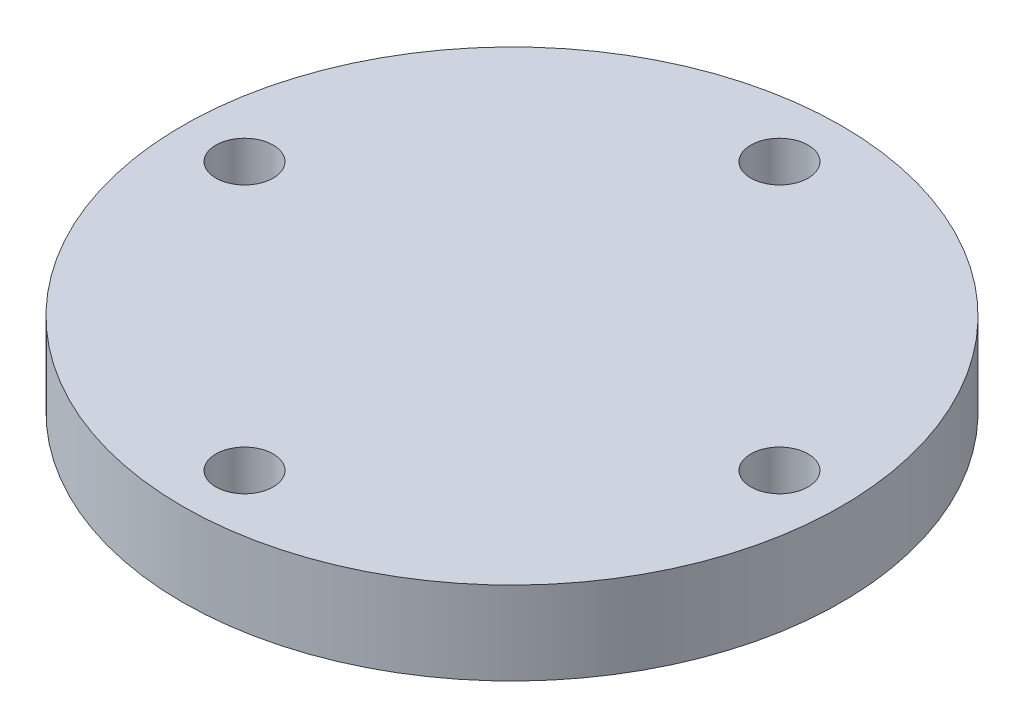
ISO-10303-21;
HEADER;
FILE_DESCRIPTION(('STEP AP214'),'2;1');
FILE_NAME('part.step','',(''),(''),'','','');
FILE_SCHEMA(('AUTOMOTIVE_DESIGN { 1 0 10303 214 1 1 1 1 }'));
ENDSEC;
DATA;
#1=APPLICATION_CONTEXT('core data for automotive mechanical design processes');
#2=APPLICATION_PROTOCOL_DEFINITION('international standard','automotive_design',2000,#1);
#3=PRODUCT_CONTEXT('',#1,'mechanical');
#4=PRODUCT('Part','Part','',(#3));
#5=PRODUCT_RELATED_PRODUCT_CATEGORY('part','',(#4));
#6=PRODUCT_DEFINITION_FORMATION('','',#4);
#7=PRODUCT_DEFINITION_CONTEXT('part definition',#1,'design');
#8=PRODUCT_DEFINITION('design','',#6,#7);
#9=PRODUCT_DEFINITION_SHAPE('','',#8);
#10=(LENGTH_UNIT() NAMED_UNIT(*) SI_UNIT(.MILLI.,.METRE.));
#11=(NAMED_UNIT(*) PLANE_ANGLE_UNIT() SI_UNIT($,.RADIAN.));
#12=(NAMED_UNIT(*) SI_UNIT($,.STERADIAN.) SOLID_ANGLE_UNIT());
#13=UNCERTAINTY_MEASURE_WITH_UNIT(LENGTH_MEASURE(1.E-05),#10,'distance_accuracy_value','');
#14=(GEOMETRIC_REPRESENTATION_CONTEXT(3) GLOBAL_UNCERTAINTY_ASSIGNED_CONTEXT((#13)) GLOBAL_UNIT_ASSIGNED_CONTEXT((#10,
#11,#12)) REPRESENTATION_CONTEXT('',''));
#15=CARTESIAN_POINT('',(0.,0.,0.));
#16=DIRECTION('',(0.,0.,1.));
#17=DIRECTION('',(1.,0.,0.));
#18=AXIS2_PLACEMENT_3D('',#15,#16,#17);
#19=CARTESIAN_POINT('',(0.,8.7,0.));
#20=DIRECTION('',(0.,-1.,0.));
#21=DIRECTION('',(0.,0.,-1.));
#22=AXIS2_PLACEMENT_3D('',#19,#20,#21);
#23=CYLINDRICAL_SURFACE('',#22,34.5);
#24=CARTESIAN_POINT('',(0.,8.7,0.));
#25=DIRECTION('',(0.,1.,0.));
#26=DIRECTION('',(0.,0.,1.));
#27=AXIS2_PLACEMENT_3D('',#24,#25,#26);
#28=CIRCLE('',#27,34.5);
#29=CARTESIAN_POINT('',(0.,8.7,34.5));
#30=VERTEX_POINT('',#29);
#31=EDGE_CURVE('E10',#30,#30,#28,.T.);
#32=ORIENTED_EDGE('',*,*,#31,.F.);
#33=EDGE_LOOP('',(#32));
#34=FACE_BOUND('',#33,.T.);
#35=CARTESIAN_POINT('',(0.,0.,0.));
#36=DIRECTION('',(0.,1.,0.));
#37=DIRECTION('',(0.,0.,1.));
#38=AXIS2_PLACEMENT_3D('',#35,#36,#37);
#39=CIRCLE('',#38,34.5);
#40=CARTESIAN_POINT('',(0.,0.,34.5));
#41=VERTEX_POINT('',#40);
#42=EDGE_CURVE('E32',#41,#41,#39,.T.);
#43=ORIENTED_EDGE('',*,*,#42,.T.);
#44=EDGE_LOOP('',(#43));
#45=FACE_BOUND('',#44,.T.);
#46=ADVANCED_FACE('F29',(#34,#45),#23,.T.);
#47=CARTESIAN_POINT('',(0.,8.7,0.));
#48=DIRECTION('',(0.,1.,0.));
#49=DIRECTION('',(0.,0.,1.));
#50=AXIS2_PLACEMENT_3D('',#47,#48,#49);
#51=PLANE('',#50);
#52=CARTESIAN_POINT('',(-27.9999999999996,8.7,3.93769828779805E-13));
#53=DIRECTION('',(0.,1.,0.));
#54=DIRECTION('',(0.,0.,1.));
#55=AXIS2_PLACEMENT_3D('',#52,#53,#54);
#56=CIRCLE('',#55,3.00000000000077);
#57=CARTESIAN_POINT('',(-27.9999999999996,8.7,3.00000000000117));
#58=VERTEX_POINT('',#57);
#59=EDGE_CURVE('E59',#58,#58,#56,.T.);
#60=ORIENTED_EDGE('',*,*,#59,.F.);
#61=EDGE_LOOP('',(#60));
#62=FACE_BOUND('',#61,.T.);
#63=CARTESIAN_POINT('',(7.94397679634836E-13,8.7,28.));
#64=DIRECTION('',(0.,1.,0.));
#65=DIRECTION('',(0.,0.,1.));
#66=AXIS2_PLACEMENT_3D('',#63,#64,#65);
#67=CIRCLE('',#66,3.00000000000077);
#68=CARTESIAN_POINT('',(7.94397679634836E-13,8.7,31.0000000000008));
#69=VERTEX_POINT('',#68);
#70=EDGE_CURVE('E53',#69,#69,#67,.T.);
#71=ORIENTED_EDGE('',*,*,#70,.F.);
#72=EDGE_LOOP('',(#71));
#73=FACE_BOUND('',#72,.T.);
#74=CARTESIAN_POINT('',(28.0000000000004,8.7,-3.97198839817418E-13));
#75=DIRECTION('',(0.,1.,0.));
#76=DIRECTION('',(0.,0.,1.));
#77=AXIS2_PLACEMENT_3D('',#74,#75,#76);
#78=CIRCLE('',#77,3.00000000000077);
#79=CARTESIAN_POINT('',(28.0000000000004,8.7,3.00000000000038));
#80=VERTEX_POINT('',#79);
#81=EDGE_CURVE('E47',#80,#80,#78,.T.);
#82=ORIENTED_EDGE('',*,*,#81,.F.);
#83=EDGE_LOOP('',(#82));
#84=FACE_BOUND('',#83,.T.);
#85=CARTESIAN_POINT('',(0.,8.7,-28.));
#86=DIRECTION('',(0.,1.,0.));
#87=DIRECTION('',(0.,0.,1.));
#88=AXIS2_PLACEMENT_3D('',#85,#86,#87);
#89=CIRCLE('',#88,3.00000000000077);
#90=CARTESIAN_POINT('',(0.,8.7,-24.9999999999992));
#91=VERTEX_POINT('',#90);
#92=EDGE_CURVE('E41',#91,#91,#89,.T.);
#93=ORIENTED_EDGE('',*,*,#92,.F.);
#94=EDGE_LOOP('',(#93));
#95=FACE_BOUND('',#94,.T.);
#96=ORIENTED_EDGE('',*,*,#31,.T.);
#97=EDGE_LOOP('',(#96));
#98=FACE_BOUND('',#97,.T.);
#99=ADVANCED_FACE('F75',(#62,#73,#84,#95,#98),#51,.T.);
#100=CARTESIAN_POINT('',(0.,0.,0.));
#101=DIRECTION('',(0.,1.,0.));
#102=DIRECTION('',(0.,0.,1.));
#103=AXIS2_PLACEMENT_3D('',#100,#101,#102);
#104=PLANE('',#103);
#105=CARTESIAN_POINT('',(-27.9999999999996,0.,3.93769828779805E-13));
#106=DIRECTION('',(0.,1.,0.));
#107=DIRECTION('',(0.,0.,1.));
#108=AXIS2_PLACEMENT_3D('',#105,#106,#107);
#109=CIRCLE('',#108,3.00000000000077);
#110=CARTESIAN_POINT('',(-27.9999999999996,0.,3.00000000000117));
#111=VERTEX_POINT('',#110);
#112=EDGE_CURVE('E56',#111,#111,#109,.T.);
#113=ORIENTED_EDGE('',*,*,#112,.T.);
#114=EDGE_LOOP('',(#113));
#115=FACE_BOUND('',#114,.T.);
#116=CARTESIAN_POINT('',(7.94397679634836E-13,0.,28.));
#117=DIRECTION('',(0.,1.,0.));
#118=DIRECTION('',(0.,0.,1.));
#119=AXIS2_PLACEMENT_3D('',#116,#117,#118);
#120=CIRCLE('',#119,3.00000000000077);
#121=CARTESIAN_POINT('',(7.94397679634836E-13,0.,31.0000000000008));
#122=VERTEX_POINT('',#121);
#123=EDGE_CURVE('E50',#122,#122,#120,.T.);
#124=ORIENTED_EDGE('',*,*,#123,.T.);
#125=EDGE_LOOP('',(#124));
#126=FACE_BOUND('',#125,.T.);
#127=CARTESIAN_POINT('',(28.0000000000004,0.,-3.97198839817418E-13));
#128=DIRECTION('',(0.,1.,0.));
#129=DIRECTION('',(0.,0.,1.));
#130=AXIS2_PLACEMENT_3D('',#127,#128,#129);
#131=CIRCLE('',#130,3.00000000000077);
#132=CARTESIAN_POINT('',(28.0000000000004,0.,3.00000000000038));
#133=VERTEX_POINT('',#132);
#134=EDGE_CURVE('E44',#133,#133,#131,.T.);
#135=ORIENTED_EDGE('',*,*,#134,.T.);
#136=EDGE_LOOP('',(#135));
#137=FACE_BOUND('',#136,.T.);
#138=CARTESIAN_POINT('',(0.,0.,-28.));
#139=DIRECTION('',(0.,1.,0.));
#140=DIRECTION('',(0.,0.,1.));
#141=AXIS2_PLACEMENT_3D('',#138,#139,#140);
#142=CIRCLE('',#141,3.00000000000077);
#143=CARTESIAN_POINT('',(0.,0.,-24.9999999999992));
#144=VERTEX_POINT('',#143);
#145=EDGE_CURVE('E39',#144,#144,#142,.T.);
#146=ORIENTED_EDGE('',*,*,#145,.T.);
#147=EDGE_LOOP('',(#146));
#148=FACE_BOUND('',#147,.T.);
#149=ORIENTED_EDGE('',*,*,#42,.F.);
#150=EDGE_LOOP('',(#149));
#151=FACE_BOUND('',#150,.T.);
#152=ADVANCED_FACE('F65',(#115,#126,#137,#148,#151),#104,.F.);
#153=CARTESIAN_POINT('',(0.,0.,-28.));
#154=DIRECTION('',(0.,1.,0.));
#155=DIRECTION('',(0.,0.,1.));
#156=AXIS2_PLACEMENT_3D('',#153,#154,#155);
#157=CYLINDRICAL_SURFACE('',#156,3.00000000000077);
#158=ORIENTED_EDGE('',*,*,#145,.F.);
#159=EDGE_LOOP('',(#158));
#160=FACE_BOUND('',#159,.T.);
#161=ORIENTED_EDGE('',*,*,#92,.T.);
#162=EDGE_LOOP('',(#161));
#163=FACE_BOUND('',#162,.T.);
#164=ADVANCED_FACE('F85',(#160,#163),#157,.F.);
#165=CARTESIAN_POINT('',(28.0000000000004,0.,-3.97198839817418E-13));
#166=DIRECTION('',(0.,1.,0.));
#167=DIRECTION('',(0.,0.,1.));
#168=AXIS2_PLACEMENT_3D('',#165,#166,#167);
#169=CYLINDRICAL_SURFACE('',#168,3.00000000000077);
#170=ORIENTED_EDGE('',*,*,#134,.F.);
#171=EDGE_LOOP('',(#170));
#172=FACE_BOUND('',#171,.T.);
#173=ORIENTED_EDGE('',*,*,#81,.T.);
#174=EDGE_LOOP('',(#173));
#175=FACE_BOUND('',#174,.T.);
#176=ADVANCED_FACE('F87',(#172,#175),#169,.F.);
#177=CARTESIAN_POINT('',(7.94397679634836E-13,0.,28.));
#178=DIRECTION('',(0.,1.,0.));
#179=DIRECTION('',(0.,0.,1.));
#180=AXIS2_PLACEMENT_3D('',#177,#178,#179);
#181=CYLINDRICAL_SURFACE('',#180,3.00000000000077);
#182=ORIENTED_EDGE('',*,*,#123,.F.);
#183=EDGE_LOOP('',(#182));
#184=FACE_BOUND('',#183,.T.);
#185=ORIENTED_EDGE('',*,*,#70,.T.);
#186=EDGE_LOOP('',(#185));
#187=FACE_BOUND('',#186,.T.);
#188=ADVANCED_FACE('F71',(#184,#187),#181,.F.);
#189=CARTESIAN_POINT('',(-27.9999999999996,0.,3.93769828779805E-13));
#190=DIRECTION('',(0.,1.,0.));
#191=DIRECTION('',(0.,0.,1.));
#192=AXIS2_PLACEMENT_3D('',#189,#190,#191);
#193=CYLINDRICAL_SURFACE('',#192,3.00000000000077);
#194=ORIENTED_EDGE('',*,*,#112,.F.);
#195=EDGE_LOOP('',(#194));
#196=FACE_BOUND('',#195,.T.);
#197=ORIENTED_EDGE('',*,*,#59,.T.);
#198=EDGE_LOOP('',(#197));
#199=FACE_BOUND('',#198,.T.);
#200=ADVANCED_FACE('F68',(#196,#199),#193,.F.);
#201=CLOSED_SHELL('',(#46,#99,#152,#164,#176,#188,#200));
#202=MANIFOLD_SOLID_BREP('B2',#201);
#203=ADVANCED_BREP_SHAPE_REPRESENTATION('',(#18,#202),#14);
#204=SHAPE_DEFINITION_REPRESENTATION(#9,#203);
ENDSEC;
END-ISO-10303-21;
